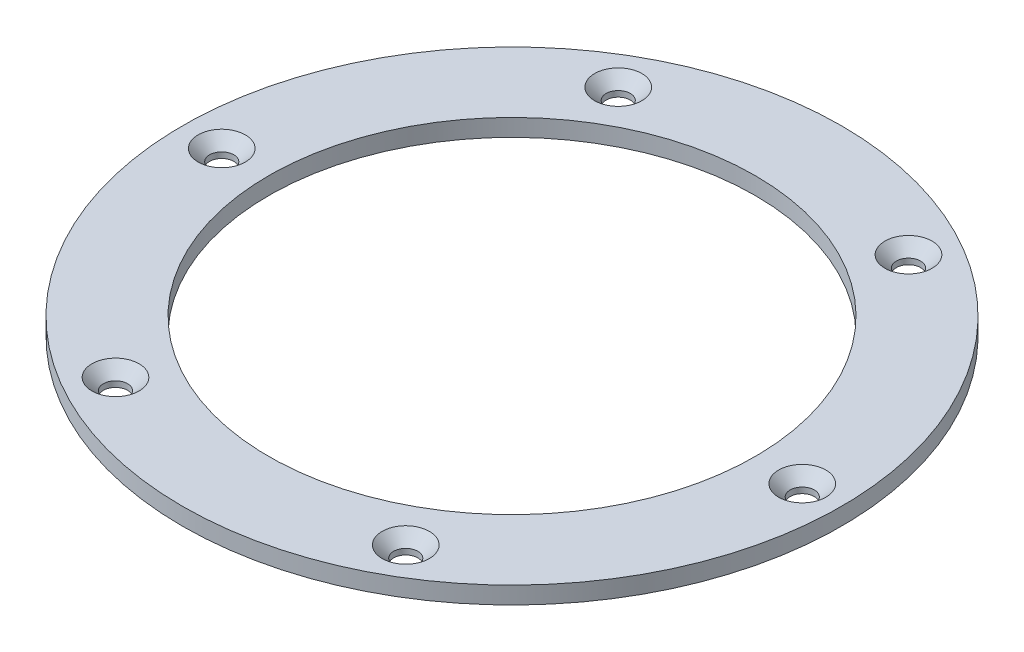
ISO-10303-21;
HEADER;
FILE_DESCRIPTION(('STEP AP214'),'2;1');
FILE_NAME('part.step','',(''),(''),'','','');
FILE_SCHEMA(('AUTOMOTIVE_DESIGN { 1 0 10303 214 1 1 1 1 }'));
ENDSEC;
DATA;
#1=APPLICATION_CONTEXT('core data for automotive mechanical design processes');
#2=APPLICATION_PROTOCOL_DEFINITION('international standard','automotive_design',2000,#1);
#3=PRODUCT_CONTEXT('',#1,'mechanical');
#4=PRODUCT('Part','Part','',(#3));
#5=PRODUCT_RELATED_PRODUCT_CATEGORY('part','',(#4));
#6=PRODUCT_DEFINITION_FORMATION('','',#4);
#7=PRODUCT_DEFINITION_CONTEXT('part definition',#1,'design');
#8=PRODUCT_DEFINITION('design','',#6,#7);
#9=PRODUCT_DEFINITION_SHAPE('','',#8);
#10=(LENGTH_UNIT() NAMED_UNIT(*) SI_UNIT(.MILLI.,.METRE.));
#11=(NAMED_UNIT(*) PLANE_ANGLE_UNIT() SI_UNIT($,.RADIAN.));
#12=(NAMED_UNIT(*) SI_UNIT($,.STERADIAN.) SOLID_ANGLE_UNIT());
#13=UNCERTAINTY_MEASURE_WITH_UNIT(LENGTH_MEASURE(1.E-05),#10,'distance_accuracy_value','');
#14=(GEOMETRIC_REPRESENTATION_CONTEXT(3) GLOBAL_UNCERTAINTY_ASSIGNED_CONTEXT((#13)) GLOBAL_UNIT_ASSIGNED_CONTEXT((#10,
#11,#12)) REPRESENTATION_CONTEXT('',''));
#15=CARTESIAN_POINT('',(0.,0.,0.));
#16=DIRECTION('',(0.,0.,1.));
#17=DIRECTION('',(1.,0.,0.));
#18=AXIS2_PLACEMENT_3D('',#15,#16,#17);
#19=CARTESIAN_POINT('',(0.,0.,0.));
#20=DIRECTION('',(0.,-1.,0.));
#21=DIRECTION('',(0.,0.,-1.));
#22=AXIS2_PLACEMENT_3D('',#19,#20,#21);
#23=CYLINDRICAL_SURFACE('',#22,57.28);
#24=CARTESIAN_POINT('',(0.,5.86590237310416,0.));
#25=DIRECTION('',(0.,-1.,0.));
#26=DIRECTION('',(0.,0.,-1.));
#27=AXIS2_PLACEMENT_3D('',#24,#25,#26);
#28=CIRCLE('',#27,57.28);
#29=CARTESIAN_POINT('',(0.,5.86590237310416,-57.28));
#30=VERTEX_POINT('',#29);
#31=EDGE_CURVE('E86',#30,#30,#28,.T.);
#32=ORIENTED_EDGE('',*,*,#31,.T.);
#33=EDGE_LOOP('',(#32));
#34=FACE_BOUND('',#33,.T.);
#35=CARTESIAN_POINT('',(0.,2.86590237310416,0.));
#36=DIRECTION('',(0.,-1.,0.));
#37=DIRECTION('',(0.,0.,-1.));
#38=AXIS2_PLACEMENT_3D('',#35,#36,#37);
#39=CIRCLE('',#38,57.28);
#40=CARTESIAN_POINT('',(0.,2.86590237310416,-57.28));
#41=VERTEX_POINT('',#40);
#42=EDGE_CURVE('E90',#41,#41,#39,.T.);
#43=ORIENTED_EDGE('',*,*,#42,.F.);
#44=EDGE_LOOP('',(#43));
#45=FACE_BOUND('',#44,.T.);
#46=ADVANCED_FACE('F41',(#34,#45),#23,.T.);
#47=CARTESIAN_POINT('',(57.28,5.86590237310416,0.));
#48=DIRECTION('',(0.,1.,0.));
#49=DIRECTION('',(0.,0.,1.));
#50=AXIS2_PLACEMENT_3D('',#47,#48,#49);
#51=PLANE('',#50);
#52=CARTESIAN_POINT('',(25.225,5.86590237310416,-43.6909816209249));
#53=DIRECTION('',(0.,1.,0.));
#54=DIRECTION('',(0.,0.,1.));
#55=AXIS2_PLACEMENT_3D('',#52,#53,#54);
#56=CIRCLE('',#55,4.10000000000002);
#57=CARTESIAN_POINT('',(25.225,5.86590237310416,-39.5909816209249));
#58=VERTEX_POINT('',#57);
#59=EDGE_CURVE('E65',#58,#58,#56,.F.);
#60=ORIENTED_EDGE('',*,*,#59,.T.);
#61=EDGE_LOOP('',(#60));
#62=FACE_BOUND('',#61,.T.);
#63=CARTESIAN_POINT('',(-50.45,5.86590237310416,0.));
#64=DIRECTION('',(0.,1.,0.));
#65=DIRECTION('',(0.,0.,1.));
#66=AXIS2_PLACEMENT_3D('',#63,#64,#65);
#67=CIRCLE('',#66,4.10000000000002);
#68=CARTESIAN_POINT('',(-50.45,5.86590237310416,4.10000000000002));
#69=VERTEX_POINT('',#68);
#70=EDGE_CURVE('E68',#69,#69,#67,.F.);
#71=ORIENTED_EDGE('',*,*,#70,.T.);
#72=EDGE_LOOP('',(#71));
#73=FACE_BOUND('',#72,.T.);
#74=CARTESIAN_POINT('',(-25.225,5.86590237310416,43.6909816209249));
#75=DIRECTION('',(0.,1.,0.));
#76=DIRECTION('',(0.,0.,1.));
#77=AXIS2_PLACEMENT_3D('',#74,#75,#76);
#78=CIRCLE('',#77,4.10000000000002);
#79=CARTESIAN_POINT('',(-25.225,5.86590237310416,47.7909816209249));
#80=VERTEX_POINT('',#79);
#81=EDGE_CURVE('E71',#80,#80,#78,.F.);
#82=ORIENTED_EDGE('',*,*,#81,.T.);
#83=EDGE_LOOP('',(#82));
#84=FACE_BOUND('',#83,.T.);
#85=CARTESIAN_POINT('',(25.225,5.86590237310416,43.6909816209249));
#86=DIRECTION('',(0.,1.,0.));
#87=DIRECTION('',(0.,0.,1.));
#88=AXIS2_PLACEMENT_3D('',#85,#86,#87);
#89=CIRCLE('',#88,4.10000000000002);
#90=CARTESIAN_POINT('',(25.225,5.86590237310416,47.7909816209249));
#91=VERTEX_POINT('',#90);
#92=EDGE_CURVE('E74',#91,#91,#89,.F.);
#93=ORIENTED_EDGE('',*,*,#92,.T.);
#94=EDGE_LOOP('',(#93));
#95=FACE_BOUND('',#94,.T.);
#96=CARTESIAN_POINT('',(50.45,5.86590237310416,0.));
#97=DIRECTION('',(0.,1.,0.));
#98=DIRECTION('',(0.,0.,1.));
#99=AXIS2_PLACEMENT_3D('',#96,#97,#98);
#100=CIRCLE('',#99,4.10000000000002);
#101=CARTESIAN_POINT('',(50.45,5.86590237310416,4.10000000000002));
#102=VERTEX_POINT('',#101);
#103=EDGE_CURVE('E77',#102,#102,#100,.F.);
#104=ORIENTED_EDGE('',*,*,#103,.T.);
#105=EDGE_LOOP('',(#104));
#106=FACE_BOUND('',#105,.T.);
#107=CARTESIAN_POINT('',(-25.225,5.86590237310416,-43.6909816209249));
#108=DIRECTION('',(0.,1.,0.));
#109=DIRECTION('',(0.,0.,1.));
#110=AXIS2_PLACEMENT_3D('',#107,#108,#109);
#111=CIRCLE('',#110,4.10000000000015);
#112=CARTESIAN_POINT('',(-25.225,5.86590237310416,-39.5909816209248));
#113=VERTEX_POINT('',#112);
#114=EDGE_CURVE('E80',#113,#113,#111,.F.);
#115=ORIENTED_EDGE('',*,*,#114,.T.);
#116=EDGE_LOOP('',(#115));
#117=FACE_BOUND('',#116,.T.);
#118=CARTESIAN_POINT('',(0.,5.86590237310416,0.));
#119=DIRECTION('',(0.,-1.,0.));
#120=DIRECTION('',(0.,0.,-1.));
#121=AXIS2_PLACEMENT_3D('',#118,#119,#120);
#122=CIRCLE('',#121,42.28);
#123=CARTESIAN_POINT('',(0.,5.86590237310416,-42.28));
#124=VERTEX_POINT('',#123);
#125=EDGE_CURVE('E108',#124,#124,#122,.T.);
#126=ORIENTED_EDGE('',*,*,#125,.T.);
#127=EDGE_LOOP('',(#126));
#128=FACE_BOUND('',#127,.T.);
#129=ORIENTED_EDGE('',*,*,#31,.F.);
#130=EDGE_LOOP('',(#129));
#131=FACE_BOUND('',#130,.T.);
#132=ADVANCED_FACE('F121',(#62,#73,#84,#95,#106,#117,#128,#131),#51,.T.);
#133=CARTESIAN_POINT('',(0.,0.,0.));
#134=DIRECTION('',(0.,-1.,0.));
#135=DIRECTION('',(0.,0.,-1.));
#136=AXIS2_PLACEMENT_3D('',#133,#134,#135);
#137=CYLINDRICAL_SURFACE('',#136,42.28);
#138=CARTESIAN_POINT('',(0.,2.86590237310416,0.));
#139=DIRECTION('',(0.,-1.,0.));
#140=DIRECTION('',(0.,0.,-1.));
#141=AXIS2_PLACEMENT_3D('',#138,#139,#140);
#142=CIRCLE('',#141,42.28);
#143=CARTESIAN_POINT('',(0.,2.86590237310416,-42.28));
#144=VERTEX_POINT('',#143);
#145=EDGE_CURVE('E111',#144,#144,#142,.T.);
#146=ORIENTED_EDGE('',*,*,#145,.T.);
#147=EDGE_LOOP('',(#146));
#148=FACE_BOUND('',#147,.T.);
#149=ORIENTED_EDGE('',*,*,#125,.F.);
#150=EDGE_LOOP('',(#149));
#151=FACE_BOUND('',#150,.T.);
#152=ADVANCED_FACE('F128',(#148,#151),#137,.F.);
#153=CARTESIAN_POINT('',(57.28,2.86590237310416,0.));
#154=DIRECTION('',(0.,-1.,0.));
#155=DIRECTION('',(0.,0.,-1.));
#156=AXIS2_PLACEMENT_3D('',#153,#154,#155);
#157=PLANE('',#156);
#158=CARTESIAN_POINT('',(-50.45,2.86590237310416,0.));
#159=DIRECTION('',(0.,-1.,0.));
#160=DIRECTION('',(0.,0.,-1.));
#161=AXIS2_PLACEMENT_3D('',#158,#159,#160);
#162=CIRCLE('',#161,2.1);
#163=CARTESIAN_POINT('',(-50.45,2.86590237310416,-2.1));
#164=VERTEX_POINT('',#163);
#165=EDGE_CURVE('E87',#164,#164,#162,.T.);
#166=ORIENTED_EDGE('',*,*,#165,.F.);
#167=EDGE_LOOP('',(#166));
#168=FACE_BOUND('',#167,.T.);
#169=CARTESIAN_POINT('',(-25.225,2.86590237310416,43.6909816209249));
#170=DIRECTION('',(0.,-1.,0.));
#171=DIRECTION('',(0.,0.,-1.));
#172=AXIS2_PLACEMENT_3D('',#169,#170,#171);
#173=CIRCLE('',#172,2.1);
#174=CARTESIAN_POINT('',(-25.225,2.86590237310416,41.5909816209249));
#175=VERTEX_POINT('',#174);
#176=EDGE_CURVE('E91',#175,#175,#173,.T.);
#177=ORIENTED_EDGE('',*,*,#176,.F.);
#178=EDGE_LOOP('',(#177));
#179=FACE_BOUND('',#178,.T.);
#180=CARTESIAN_POINT('',(25.225,2.86590237310416,43.6909816209249));
#181=DIRECTION('',(0.,-1.,0.));
#182=DIRECTION('',(0.,0.,-1.));
#183=AXIS2_PLACEMENT_3D('',#180,#181,#182);
#184=CIRCLE('',#183,2.1);
#185=CARTESIAN_POINT('',(25.225,2.86590237310416,41.5909816209249));
#186=VERTEX_POINT('',#185);
#187=EDGE_CURVE('E94',#186,#186,#184,.T.);
#188=ORIENTED_EDGE('',*,*,#187,.F.);
#189=EDGE_LOOP('',(#188));
#190=FACE_BOUND('',#189,.T.);
#191=CARTESIAN_POINT('',(50.45,2.86590237310416,0.));
#192=DIRECTION('',(0.,-1.,0.));
#193=DIRECTION('',(0.,0.,-1.));
#194=AXIS2_PLACEMENT_3D('',#191,#192,#193);
#195=CIRCLE('',#194,2.1);
#196=CARTESIAN_POINT('',(50.45,2.86590237310416,-2.1));
#197=VERTEX_POINT('',#196);
#198=EDGE_CURVE('E97',#197,#197,#195,.T.);
#199=ORIENTED_EDGE('',*,*,#198,.F.);
#200=EDGE_LOOP('',(#199));
#201=FACE_BOUND('',#200,.T.);
#202=CARTESIAN_POINT('',(25.225,2.86590237310416,-43.6909816209249));
#203=DIRECTION('',(0.,-1.,0.));
#204=DIRECTION('',(0.,0.,-1.));
#205=AXIS2_PLACEMENT_3D('',#202,#203,#204);
#206=CIRCLE('',#205,2.1);
#207=CARTESIAN_POINT('',(25.225,2.86590237310416,-45.7909816209249));
#208=VERTEX_POINT('',#207);
#209=EDGE_CURVE('E100',#208,#208,#206,.T.);
#210=ORIENTED_EDGE('',*,*,#209,.F.);
#211=EDGE_LOOP('',(#210));
#212=FACE_BOUND('',#211,.T.);
#213=CARTESIAN_POINT('',(-25.225,2.86590237310416,-43.6909816209249));
#214=DIRECTION('',(0.,-1.,0.));
#215=DIRECTION('',(0.,0.,-1.));
#216=AXIS2_PLACEMENT_3D('',#213,#214,#215);
#217=CIRCLE('',#216,2.10000000000012);
#218=CARTESIAN_POINT('',(-25.225,2.86590237310416,-45.7909816209251));
#219=VERTEX_POINT('',#218);
#220=EDGE_CURVE('E103',#219,#219,#217,.T.);
#221=ORIENTED_EDGE('',*,*,#220,.F.);
#222=EDGE_LOOP('',(#221));
#223=FACE_BOUND('',#222,.T.);
#224=ORIENTED_EDGE('',*,*,#42,.T.);
#225=EDGE_LOOP('',(#224));
#226=FACE_BOUND('',#225,.T.);
#227=ORIENTED_EDGE('',*,*,#145,.F.);
#228=EDGE_LOOP('',(#227));
#229=FACE_BOUND('',#228,.T.);
#230=ADVANCED_FACE('F117',(#168,#179,#190,#201,#212,#223,#226,#229),#157,.T.);
#231=CARTESIAN_POINT('',(-25.225,-4.13409762689584,-43.6909816209249));
#232=DIRECTION('',(0.,1.,0.));
#233=DIRECTION('',(0.,0.,1.));
#234=AXIS2_PLACEMENT_3D('',#231,#232,#233);
#235=CYLINDRICAL_SURFACE('',#234,2.10000000000012);
#236=CARTESIAN_POINT('',(-25.225,3.86590237310416,-43.6909816209249));
#237=DIRECTION('',(0.,1.,0.));
#238=DIRECTION('',(0.,0.,1.));
#239=AXIS2_PLACEMENT_3D('',#236,#237,#238);
#240=CIRCLE('',#239,2.10000000000012);
#241=CARTESIAN_POINT('',(-25.225,3.86590237310416,-41.5909816209248));
#242=VERTEX_POINT('',#241);
#243=EDGE_CURVE('E10',#242,#242,#240,.T.);
#244=ORIENTED_EDGE('',*,*,#243,.T.);
#245=EDGE_LOOP('',(#244));
#246=FACE_BOUND('',#245,.T.);
#247=ORIENTED_EDGE('',*,*,#220,.T.);
#248=EDGE_LOOP('',(#247));
#249=FACE_BOUND('',#248,.T.);
#250=ADVANCED_FACE('F185',(#246,#249),#235,.F.);
#251=CARTESIAN_POINT('',(25.225,-4.13409762689584,-43.6909816209249));
#252=DIRECTION('',(0.,1.,0.));
#253=DIRECTION('',(0.,0.,1.));
#254=AXIS2_PLACEMENT_3D('',#251,#252,#253);
#255=CYLINDRICAL_SURFACE('',#254,2.1);
#256=CARTESIAN_POINT('',(25.225,3.86590237310415,-43.6909816209249));
#257=DIRECTION('',(0.,1.,0.));
#258=DIRECTION('',(0.,0.,1.));
#259=AXIS2_PLACEMENT_3D('',#256,#257,#258);
#260=CIRCLE('',#259,2.1);
#261=CARTESIAN_POINT('',(25.225,3.86590237310415,-41.5909816209249));
#262=VERTEX_POINT('',#261);
#263=EDGE_CURVE('E83',#262,#262,#260,.T.);
#264=ORIENTED_EDGE('',*,*,#263,.T.);
#265=EDGE_LOOP('',(#264));
#266=FACE_BOUND('',#265,.T.);
#267=ORIENTED_EDGE('',*,*,#209,.T.);
#268=EDGE_LOOP('',(#267));
#269=FACE_BOUND('',#268,.T.);
#270=ADVANCED_FACE('F197',(#266,#269),#255,.F.);
#271=CARTESIAN_POINT('',(50.45,-4.13409762689584,0.));
#272=DIRECTION('',(0.,1.,0.));
#273=DIRECTION('',(0.,0.,1.));
#274=AXIS2_PLACEMENT_3D('',#271,#272,#273);
#275=CYLINDRICAL_SURFACE('',#274,2.1);
#276=CARTESIAN_POINT('',(50.45,3.86590237310415,0.));
#277=DIRECTION('',(0.,1.,0.));
#278=DIRECTION('',(0.,0.,1.));
#279=AXIS2_PLACEMENT_3D('',#276,#277,#278);
#280=CIRCLE('',#279,2.1);
#281=CARTESIAN_POINT('',(50.45,3.86590237310415,2.09999999999999));
#282=VERTEX_POINT('',#281);
#283=EDGE_CURVE('E49',#282,#282,#280,.T.);
#284=ORIENTED_EDGE('',*,*,#283,.T.);
#285=EDGE_LOOP('',(#284));
#286=FACE_BOUND('',#285,.T.);
#287=ORIENTED_EDGE('',*,*,#198,.T.);
#288=EDGE_LOOP('',(#287));
#289=FACE_BOUND('',#288,.T.);
#290=ADVANCED_FACE('F193',(#286,#289),#275,.F.);
#291=CARTESIAN_POINT('',(25.225,-4.13409762689584,43.6909816209249));
#292=DIRECTION('',(0.,1.,0.));
#293=DIRECTION('',(0.,0.,1.));
#294=AXIS2_PLACEMENT_3D('',#291,#292,#293);
#295=CYLINDRICAL_SURFACE('',#294,2.1);
#296=CARTESIAN_POINT('',(25.225,3.86590237310415,43.6909816209249));
#297=DIRECTION('',(0.,1.,0.));
#298=DIRECTION('',(0.,0.,1.));
#299=AXIS2_PLACEMENT_3D('',#296,#297,#298);
#300=CIRCLE('',#299,2.1);
#301=CARTESIAN_POINT('',(25.225,3.86590237310415,45.7909816209249));
#302=VERTEX_POINT('',#301);
#303=EDGE_CURVE('E53',#302,#302,#300,.T.);
#304=ORIENTED_EDGE('',*,*,#303,.T.);
#305=EDGE_LOOP('',(#304));
#306=FACE_BOUND('',#305,.T.);
#307=ORIENTED_EDGE('',*,*,#187,.T.);
#308=EDGE_LOOP('',(#307));
#309=FACE_BOUND('',#308,.T.);
#310=ADVANCED_FACE('F189',(#306,#309),#295,.F.);
#311=CARTESIAN_POINT('',(-25.225,-4.13409762689584,43.6909816209249));
#312=DIRECTION('',(0.,1.,0.));
#313=DIRECTION('',(0.,0.,1.));
#314=AXIS2_PLACEMENT_3D('',#311,#312,#313);
#315=CYLINDRICAL_SURFACE('',#314,2.1);
#316=CARTESIAN_POINT('',(-25.225,3.86590237310415,43.6909816209249));
#317=DIRECTION('',(0.,1.,0.));
#318=DIRECTION('',(0.,0.,1.));
#319=AXIS2_PLACEMENT_3D('',#316,#317,#318);
#320=CIRCLE('',#319,2.1);
#321=CARTESIAN_POINT('',(-25.225,3.86590237310415,45.7909816209249));
#322=VERTEX_POINT('',#321);
#323=EDGE_CURVE('E57',#322,#322,#320,.T.);
#324=ORIENTED_EDGE('',*,*,#323,.T.);
#325=EDGE_LOOP('',(#324));
#326=FACE_BOUND('',#325,.T.);
#327=ORIENTED_EDGE('',*,*,#176,.T.);
#328=EDGE_LOOP('',(#327));
#329=FACE_BOUND('',#328,.T.);
#330=ADVANCED_FACE('F192',(#326,#329),#315,.F.);
#331=CARTESIAN_POINT('',(-50.45,-4.13409762689584,0.));
#332=DIRECTION('',(0.,1.,0.));
#333=DIRECTION('',(0.,0.,1.));
#334=AXIS2_PLACEMENT_3D('',#331,#332,#333);
#335=CYLINDRICAL_SURFACE('',#334,2.1);
#336=CARTESIAN_POINT('',(-50.45,3.86590237310415,0.));
#337=DIRECTION('',(0.,1.,0.));
#338=DIRECTION('',(0.,0.,1.));
#339=AXIS2_PLACEMENT_3D('',#336,#337,#338);
#340=CIRCLE('',#339,2.1);
#341=CARTESIAN_POINT('',(-50.45,3.86590237310415,2.09999999999999));
#342=VERTEX_POINT('',#341);
#343=EDGE_CURVE('E62',#342,#342,#340,.T.);
#344=ORIENTED_EDGE('',*,*,#343,.T.);
#345=EDGE_LOOP('',(#344));
#346=FACE_BOUND('',#345,.T.);
#347=ORIENTED_EDGE('',*,*,#165,.T.);
#348=EDGE_LOOP('',(#347));
#349=FACE_BOUND('',#348,.T.);
#350=ADVANCED_FACE('F141',(#346,#349),#335,.F.);
#351=CARTESIAN_POINT('',(25.225,3.86590237310415,-43.6909816209249));
#352=DIRECTION('',(0.,1.,0.));
#353=DIRECTION('',(0.,0.,1.));
#354=AXIS2_PLACEMENT_3D('',#351,#352,#353);
#355=CONICAL_SURFACE('',#354,2.1,0.78539816339745);
#356=ORIENTED_EDGE('',*,*,#59,.F.);
#357=EDGE_LOOP('',(#356));
#358=FACE_BOUND('',#357,.T.);
#359=ORIENTED_EDGE('',*,*,#263,.F.);
#360=EDGE_LOOP('',(#359));
#361=FACE_BOUND('',#360,.T.);
#362=ADVANCED_FACE('F134',(#358,#361),#355,.F.);
#363=CARTESIAN_POINT('',(-50.45,3.86590237310415,0.));
#364=DIRECTION('',(0.,1.,0.));
#365=DIRECTION('',(0.,0.,1.));
#366=AXIS2_PLACEMENT_3D('',#363,#364,#365);
#367=CONICAL_SURFACE('',#366,2.1,0.78539816339745);
#368=ORIENTED_EDGE('',*,*,#70,.F.);
#369=EDGE_LOOP('',(#368));
#370=FACE_BOUND('',#369,.T.);
#371=ORIENTED_EDGE('',*,*,#343,.F.);
#372=EDGE_LOOP('',(#371));
#373=FACE_BOUND('',#372,.T.);
#374=ADVANCED_FACE('F140',(#370,#373),#367,.F.);
#375=CARTESIAN_POINT('',(-25.225,3.86590237310415,43.6909816209249));
#376=DIRECTION('',(0.,1.,0.));
#377=DIRECTION('',(0.,0.,1.));
#378=AXIS2_PLACEMENT_3D('',#375,#376,#377);
#379=CONICAL_SURFACE('',#378,2.1,0.78539816339745);
#380=ORIENTED_EDGE('',*,*,#81,.F.);
#381=EDGE_LOOP('',(#380));
#382=FACE_BOUND('',#381,.T.);
#383=ORIENTED_EDGE('',*,*,#323,.F.);
#384=EDGE_LOOP('',(#383));
#385=FACE_BOUND('',#384,.T.);
#386=ADVANCED_FACE('F148',(#382,#385),#379,.F.);
#387=CARTESIAN_POINT('',(25.225,3.86590237310415,43.6909816209249));
#388=DIRECTION('',(0.,1.,0.));
#389=DIRECTION('',(0.,0.,1.));
#390=AXIS2_PLACEMENT_3D('',#387,#388,#389);
#391=CONICAL_SURFACE('',#390,2.1,0.78539816339745);
#392=ORIENTED_EDGE('',*,*,#92,.F.);
#393=EDGE_LOOP('',(#392));
#394=FACE_BOUND('',#393,.T.);
#395=ORIENTED_EDGE('',*,*,#303,.F.);
#396=EDGE_LOOP('',(#395));
#397=FACE_BOUND('',#396,.T.);
#398=ADVANCED_FACE('F155',(#394,#397),#391,.F.);
#399=CARTESIAN_POINT('',(50.45,3.86590237310415,0.));
#400=DIRECTION('',(0.,1.,0.));
#401=DIRECTION('',(0.,0.,1.));
#402=AXIS2_PLACEMENT_3D('',#399,#400,#401);
#403=CONICAL_SURFACE('',#402,2.1,0.78539816339745);
#404=ORIENTED_EDGE('',*,*,#103,.F.);
#405=EDGE_LOOP('',(#404));
#406=FACE_BOUND('',#405,.T.);
#407=ORIENTED_EDGE('',*,*,#283,.F.);
#408=EDGE_LOOP('',(#407));
#409=FACE_BOUND('',#408,.T.);
#410=ADVANCED_FACE('F161',(#406,#409),#403,.F.);
#411=CARTESIAN_POINT('',(-25.225,3.86590237310416,-43.6909816209249));
#412=DIRECTION('',(0.,1.,0.));
#413=DIRECTION('',(0.,0.,1.));
#414=AXIS2_PLACEMENT_3D('',#411,#412,#413);
#415=CONICAL_SURFACE('',#414,2.10000000000012,0.785398163397453);
#416=ORIENTED_EDGE('',*,*,#114,.F.);
#417=EDGE_LOOP('',(#416));
#418=FACE_BOUND('',#417,.T.);
#419=ORIENTED_EDGE('',*,*,#243,.F.);
#420=EDGE_LOOP('',(#419));
#421=FACE_BOUND('',#420,.T.);
#422=ADVANCED_FACE('F44',(#418,#421),#415,.F.);
#423=CLOSED_SHELL('',(#46,#132,#152,#230,#250,#270,#290,#310,#330,#350,#362,#374,#386,#398,#410,#422));
#424=MANIFOLD_SOLID_BREP('B2',#423);
#425=ADVANCED_BREP_SHAPE_REPRESENTATION('',(#18,#424),#14);
#426=SHAPE_DEFINITION_REPRESENTATION(#9,#425);
ENDSEC;
END-ISO-10303-21;
